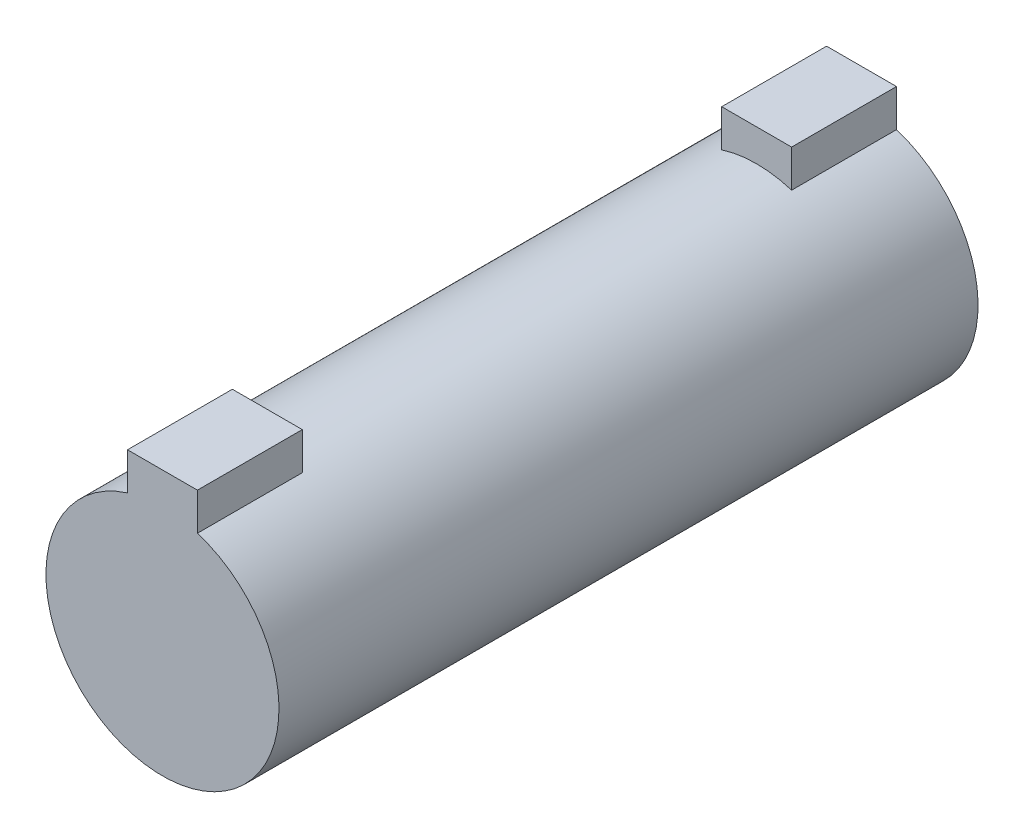
ISO-10303-21;
HEADER;
FILE_DESCRIPTION(('STEP AP214'),'2;1');
FILE_NAME('part.step','',(''),(''),'','','');
FILE_SCHEMA(('AUTOMOTIVE_DESIGN { 1 0 10303 214 1 1 1 1 }'));
ENDSEC;
DATA;
#1=APPLICATION_CONTEXT('core data for automotive mechanical design processes');
#2=APPLICATION_PROTOCOL_DEFINITION('international standard','automotive_design',2000,#1);
#3=PRODUCT_CONTEXT('',#1,'mechanical');
#4=PRODUCT('Part','Part','',(#3));
#5=PRODUCT_RELATED_PRODUCT_CATEGORY('part','',(#4));
#6=PRODUCT_DEFINITION_FORMATION('','',#4);
#7=PRODUCT_DEFINITION_CONTEXT('part definition',#1,'design');
#8=PRODUCT_DEFINITION('design','',#6,#7);
#9=PRODUCT_DEFINITION_SHAPE('','',#8);
#10=(LENGTH_UNIT() NAMED_UNIT(*) SI_UNIT(.MILLI.,.METRE.));
#11=(NAMED_UNIT(*) PLANE_ANGLE_UNIT() SI_UNIT($,.RADIAN.));
#12=(NAMED_UNIT(*) SI_UNIT($,.STERADIAN.) SOLID_ANGLE_UNIT());
#13=UNCERTAINTY_MEASURE_WITH_UNIT(LENGTH_MEASURE(1.E-05),#10,'distance_accuracy_value','');
#14=(GEOMETRIC_REPRESENTATION_CONTEXT(3) GLOBAL_UNCERTAINTY_ASSIGNED_CONTEXT((#13)) GLOBAL_UNIT_ASSIGNED_CONTEXT((#10,
#11,#12)) REPRESENTATION_CONTEXT('',''));
#15=CARTESIAN_POINT('',(0.,0.,0.));
#16=DIRECTION('',(0.,0.,1.));
#17=DIRECTION('',(1.,0.,0.));
#18=AXIS2_PLACEMENT_3D('',#15,#16,#17);
#19=CARTESIAN_POINT('',(0.,0.,30.));
#20=DIRECTION('',(0.,0.,-1.));
#21=DIRECTION('',(-1.,0.,0.));
#22=AXIS2_PLACEMENT_3D('',#19,#20,#21);
#23=CYLINDRICAL_SURFACE('',#22,10.);
#24=CARTESIAN_POINT('',(0.,0.,30.));
#25=DIRECTION('',(0.,0.,1.));
#26=DIRECTION('',(1.,0.,0.));
#27=AXIS2_PLACEMENT_3D('',#24,#25,#26);
#28=CIRCLE('',#27,10.);
#29=CARTESIAN_POINT('',(-3.,9.53939201416946,30.));
#30=VERTEX_POINT('',#29);
#31=CARTESIAN_POINT('',(3.,9.53939201416946,30.));
#32=VERTEX_POINT('',#31);
#33=EDGE_CURVE('E160',#30,#32,#28,.T.);
#34=ORIENTED_EDGE('',*,*,#33,.F.);
#35=DIRECTION('',(0.,0.,-1.));
#36=VECTOR('',#35,1.);
#37=CARTESIAN_POINT('',(-3.,9.53939201416945,30.));
#38=LINE('',#37,#36);
#39=CARTESIAN_POINT('',(-3.,9.53939201416945,21.));
#40=VERTEX_POINT('',#39);
#41=EDGE_CURVE('E156',#30,#40,#38,.T.);
#42=ORIENTED_EDGE('',*,*,#41,.T.);
#43=CARTESIAN_POINT('',(0.,0.,21.));
#44=DIRECTION('',(0.,0.,-1.));
#45=DIRECTION('',(-1.,0.,0.));
#46=AXIS2_PLACEMENT_3D('',#43,#44,#45);
#47=CIRCLE('',#46,10.);
#48=CARTESIAN_POINT('',(3.,9.53939201416946,21.));
#49=VERTEX_POINT('',#48);
#50=EDGE_CURVE('E45',#40,#49,#47,.T.);
#51=ORIENTED_EDGE('',*,*,#50,.T.);
#52=DIRECTION('',(0.,0.,-1.));
#53=VECTOR('',#52,1.);
#54=CARTESIAN_POINT('',(3.,9.53939201416946,30.));
#55=LINE('',#54,#53);
#56=EDGE_CURVE('E151',#49,#32,#55,.F.);
#57=ORIENTED_EDGE('',*,*,#56,.T.);
#58=EDGE_LOOP('',(#34,#42,#51,#57));
#59=FACE_BOUND('',#58,.T.);
#60=DIRECTION('',(0.,0.,-1.));
#61=VECTOR('',#60,1.);
#62=CARTESIAN_POINT('',(-3.,9.53939201416945,30.));
#63=LINE('',#62,#61);
#64=CARTESIAN_POINT('',(-3.,9.53939201416946,-30.));
#65=VERTEX_POINT('',#64);
#66=CARTESIAN_POINT('',(-3.,9.53939201416945,-21.));
#67=VERTEX_POINT('',#66);
#68=EDGE_CURVE('E121',#65,#67,#63,.F.);
#69=ORIENTED_EDGE('',*,*,#68,.F.);
#70=CARTESIAN_POINT('',(0.,0.,-30.));
#71=DIRECTION('',(0.,0.,1.));
#72=DIRECTION('',(1.,0.,0.));
#73=AXIS2_PLACEMENT_3D('',#70,#71,#72);
#74=CIRCLE('',#73,10.);
#75=CARTESIAN_POINT('',(3.,9.53939201416946,-30.));
#76=VERTEX_POINT('',#75);
#77=EDGE_CURVE('E159',#65,#76,#74,.T.);
#78=ORIENTED_EDGE('',*,*,#77,.T.);
#79=DIRECTION('',(0.,0.,-1.));
#80=VECTOR('',#79,1.);
#81=CARTESIAN_POINT('',(3.,9.53939201416946,30.));
#82=LINE('',#81,#80);
#83=CARTESIAN_POINT('',(3.,9.53939201416946,-21.));
#84=VERTEX_POINT('',#83);
#85=EDGE_CURVE('E55',#84,#76,#82,.T.);
#86=ORIENTED_EDGE('',*,*,#85,.F.);
#87=CARTESIAN_POINT('',(0.,0.,-21.));
#88=DIRECTION('',(0.,0.,1.));
#89=DIRECTION('',(1.,0.,0.));
#90=AXIS2_PLACEMENT_3D('',#87,#88,#89);
#91=CIRCLE('',#90,10.);
#92=EDGE_CURVE('E11',#84,#67,#91,.T.);
#93=ORIENTED_EDGE('',*,*,#92,.T.);
#94=EDGE_LOOP('',(#69,#78,#86,#93));
#95=FACE_BOUND('',#94,.T.);
#96=ADVANCED_FACE('F38',(#59,#95),#23,.T.);
#97=CARTESIAN_POINT('',(0.,0.,30.));
#98=DIRECTION('',(0.,0.,1.));
#99=DIRECTION('',(1.,0.,0.));
#100=AXIS2_PLACEMENT_3D('',#97,#98,#99);
#101=PLANE('',#100);
#102=ORIENTED_EDGE('',*,*,#33,.T.);
#103=DIRECTION('',(0.,1.,0.));
#104=VECTOR('',#103,1.);
#105=CARTESIAN_POINT('',(3.,12.745019423315,30.));
#106=LINE('',#105,#104);
#107=CARTESIAN_POINT('',(3.,12.745019423315,30.));
#108=VERTEX_POINT('',#107);
#109=EDGE_CURVE('E145',#32,#108,#106,.T.);
#110=ORIENTED_EDGE('',*,*,#109,.T.);
#111=DIRECTION('',(-1.,0.,0.));
#112=VECTOR('',#111,1.);
#113=CARTESIAN_POINT('',(3.,12.745019423315,30.));
#114=LINE('',#113,#112);
#115=CARTESIAN_POINT('',(-3.,12.745019423315,30.));
#116=VERTEX_POINT('',#115);
#117=EDGE_CURVE('E138',#108,#116,#114,.T.);
#118=ORIENTED_EDGE('',*,*,#117,.T.);
#119=DIRECTION('',(0.,-1.,0.));
#120=VECTOR('',#119,1.);
#121=CARTESIAN_POINT('',(-3.,12.745019423315,30.));
#122=LINE('',#121,#120);
#123=EDGE_CURVE('E133',#116,#30,#122,.T.);
#124=ORIENTED_EDGE('',*,*,#123,.T.);
#125=EDGE_LOOP('',(#102,#110,#118,#124));
#126=FACE_BOUND('',#125,.T.);
#127=ADVANCED_FACE('F182',(#126),#101,.T.);
#128=CARTESIAN_POINT('',(0.,0.,-30.));
#129=DIRECTION('',(0.,0.,1.));
#130=DIRECTION('',(1.,0.,0.));
#131=AXIS2_PLACEMENT_3D('',#128,#129,#130);
#132=PLANE('',#131);
#133=ORIENTED_EDGE('',*,*,#77,.F.);
#134=DIRECTION('',(0.,-1.,0.));
#135=VECTOR('',#134,1.);
#136=CARTESIAN_POINT('',(-3.,12.745019423315,-30.));
#137=LINE('',#136,#135);
#138=CARTESIAN_POINT('',(-3.,12.745019423315,-30.));
#139=VERTEX_POINT('',#138);
#140=EDGE_CURVE('E127',#139,#65,#137,.T.);
#141=ORIENTED_EDGE('',*,*,#140,.F.);
#142=DIRECTION('',(-1.,0.,0.));
#143=VECTOR('',#142,1.);
#144=CARTESIAN_POINT('',(3.,12.745019423315,-30.));
#145=LINE('',#144,#143);
#146=CARTESIAN_POINT('',(3.,12.745019423315,-30.));
#147=VERTEX_POINT('',#146);
#148=EDGE_CURVE('E114',#147,#139,#145,.T.);
#149=ORIENTED_EDGE('',*,*,#148,.F.);
#150=DIRECTION('',(0.,1.,0.));
#151=VECTOR('',#150,1.);
#152=CARTESIAN_POINT('',(3.,12.745019423315,-30.));
#153=LINE('',#152,#151);
#154=EDGE_CURVE('E122',#76,#147,#153,.T.);
#155=ORIENTED_EDGE('',*,*,#154,.F.);
#156=EDGE_LOOP('',(#133,#141,#149,#155));
#157=FACE_BOUND('',#156,.T.);
#158=ADVANCED_FACE('F184',(#157),#132,.F.);
#159=CARTESIAN_POINT('',(-3.,12.745019423315,21.));
#160=DIRECTION('',(-1.,0.,0.));
#161=DIRECTION('',(0.,0.,1.));
#162=AXIS2_PLACEMENT_3D('',#159,#160,#161);
#163=PLANE('',#162);
#164=ORIENTED_EDGE('',*,*,#41,.F.);
#165=ORIENTED_EDGE('',*,*,#123,.F.);
#166=DIRECTION('',(0.,0.,1.));
#167=VECTOR('',#166,1.);
#168=CARTESIAN_POINT('',(-3.,12.745019423315,21.));
#169=LINE('',#168,#167);
#170=CARTESIAN_POINT('',(-3.,12.745019423315,21.));
#171=VERTEX_POINT('',#170);
#172=EDGE_CURVE('E149',#171,#116,#169,.T.);
#173=ORIENTED_EDGE('',*,*,#172,.F.);
#174=DIRECTION('',(0.,-1.,0.));
#175=VECTOR('',#174,1.);
#176=CARTESIAN_POINT('',(-3.,12.745019423315,21.));
#177=LINE('',#176,#175);
#178=EDGE_CURVE('E134',#171,#40,#177,.T.);
#179=ORIENTED_EDGE('',*,*,#178,.T.);
#180=EDGE_LOOP('',(#164,#165,#173,#179));
#181=FACE_BOUND('',#180,.T.);
#182=ADVANCED_FACE('F173',(#181),#163,.T.);
#183=CARTESIAN_POINT('',(3.,12.745019423315,21.));
#184=DIRECTION('',(1.,0.,0.));
#185=DIRECTION('',(0.,0.,-1.));
#186=AXIS2_PLACEMENT_3D('',#183,#184,#185);
#187=PLANE('',#186);
#188=ORIENTED_EDGE('',*,*,#56,.F.);
#189=DIRECTION('',(0.,1.,0.));
#190=VECTOR('',#189,1.);
#191=CARTESIAN_POINT('',(3.,12.745019423315,21.));
#192=LINE('',#191,#190);
#193=CARTESIAN_POINT('',(3.,12.745019423315,21.));
#194=VERTEX_POINT('',#193);
#195=EDGE_CURVE('E137',#49,#194,#192,.T.);
#196=ORIENTED_EDGE('',*,*,#195,.T.);
#197=DIRECTION('',(0.,0.,1.));
#198=VECTOR('',#197,1.);
#199=CARTESIAN_POINT('',(3.,12.745019423315,21.));
#200=LINE('',#199,#198);
#201=EDGE_CURVE('E143',#194,#108,#200,.T.);
#202=ORIENTED_EDGE('',*,*,#201,.T.);
#203=ORIENTED_EDGE('',*,*,#109,.F.);
#204=EDGE_LOOP('',(#188,#196,#202,#203));
#205=FACE_BOUND('',#204,.T.);
#206=ADVANCED_FACE('F180',(#205),#187,.T.);
#207=CARTESIAN_POINT('',(3.,12.745019423315,21.));
#208=DIRECTION('',(0.,1.,0.));
#209=DIRECTION('',(0.,0.,1.));
#210=AXIS2_PLACEMENT_3D('',#207,#208,#209);
#211=PLANE('',#210);
#212=ORIENTED_EDGE('',*,*,#117,.F.);
#213=ORIENTED_EDGE('',*,*,#201,.F.);
#214=DIRECTION('',(-1.,0.,0.));
#215=VECTOR('',#214,1.);
#216=CARTESIAN_POINT('',(3.,12.745019423315,21.));
#217=LINE('',#216,#215);
#218=EDGE_CURVE('E140',#194,#171,#217,.T.);
#219=ORIENTED_EDGE('',*,*,#218,.T.);
#220=ORIENTED_EDGE('',*,*,#172,.T.);
#221=EDGE_LOOP('',(#212,#213,#219,#220));
#222=FACE_BOUND('',#221,.T.);
#223=ADVANCED_FACE('F177',(#222),#211,.T.);
#224=CARTESIAN_POINT('',(0.,0.,21.));
#225=DIRECTION('',(0.,0.,-1.));
#226=DIRECTION('',(-1.,0.,0.));
#227=AXIS2_PLACEMENT_3D('',#224,#225,#226);
#228=PLANE('',#227);
#229=ORIENTED_EDGE('',*,*,#50,.F.);
#230=ORIENTED_EDGE('',*,*,#178,.F.);
#231=ORIENTED_EDGE('',*,*,#218,.F.);
#232=ORIENTED_EDGE('',*,*,#195,.F.);
#233=EDGE_LOOP('',(#229,#230,#231,#232));
#234=FACE_BOUND('',#233,.T.);
#235=ADVANCED_FACE('F170',(#234),#228,.T.);
#236=CARTESIAN_POINT('',(-3.,12.745019423315,-21.));
#237=DIRECTION('',(1.,0.,0.));
#238=DIRECTION('',(0.,0.,-1.));
#239=AXIS2_PLACEMENT_3D('',#236,#237,#238);
#240=PLANE('',#239);
#241=ORIENTED_EDGE('',*,*,#140,.T.);
#242=ORIENTED_EDGE('',*,*,#68,.T.);
#243=DIRECTION('',(0.,-1.,0.));
#244=VECTOR('',#243,1.);
#245=CARTESIAN_POINT('',(-3.,12.745019423315,-21.));
#246=LINE('',#245,#244);
#247=CARTESIAN_POINT('',(-3.,12.745019423315,-21.));
#248=VERTEX_POINT('',#247);
#249=EDGE_CURVE('E103',#248,#67,#246,.T.);
#250=ORIENTED_EDGE('',*,*,#249,.F.);
#251=DIRECTION('',(0.,0.,-1.));
#252=VECTOR('',#251,1.);
#253=CARTESIAN_POINT('',(-3.,12.745019423315,-21.));
#254=LINE('',#253,#252);
#255=EDGE_CURVE('E111',#248,#139,#254,.T.);
#256=ORIENTED_EDGE('',*,*,#255,.T.);
#257=EDGE_LOOP('',(#241,#242,#250,#256));
#258=FACE_BOUND('',#257,.T.);
#259=ADVANCED_FACE('F120',(#258),#240,.F.);
#260=CARTESIAN_POINT('',(3.,12.745019423315,-21.));
#261=DIRECTION('',(-1.,0.,0.));
#262=DIRECTION('',(0.,0.,1.));
#263=AXIS2_PLACEMENT_3D('',#260,#261,#262);
#264=PLANE('',#263);
#265=DIRECTION('',(0.,1.,0.));
#266=VECTOR('',#265,1.);
#267=CARTESIAN_POINT('',(3.,12.745019423315,-21.));
#268=LINE('',#267,#266);
#269=CARTESIAN_POINT('',(3.,12.745019423315,-21.));
#270=VERTEX_POINT('',#269);
#271=EDGE_CURVE('E105',#84,#270,#268,.T.);
#272=ORIENTED_EDGE('',*,*,#271,.F.);
#273=ORIENTED_EDGE('',*,*,#85,.T.);
#274=ORIENTED_EDGE('',*,*,#154,.T.);
#275=DIRECTION('',(0.,0.,-1.));
#276=VECTOR('',#275,1.);
#277=CARTESIAN_POINT('',(3.,12.745019423315,-21.));
#278=LINE('',#277,#276);
#279=EDGE_CURVE('E118',#270,#147,#278,.T.);
#280=ORIENTED_EDGE('',*,*,#279,.F.);
#281=EDGE_LOOP('',(#272,#273,#274,#280));
#282=FACE_BOUND('',#281,.T.);
#283=ADVANCED_FACE('F202',(#282),#264,.F.);
#284=CARTESIAN_POINT('',(3.,12.745019423315,-21.));
#285=DIRECTION('',(0.,-1.,0.));
#286=DIRECTION('',(0.,0.,-1.));
#287=AXIS2_PLACEMENT_3D('',#284,#285,#286);
#288=PLANE('',#287);
#289=ORIENTED_EDGE('',*,*,#148,.T.);
#290=ORIENTED_EDGE('',*,*,#255,.F.);
#291=DIRECTION('',(-1.,0.,0.));
#292=VECTOR('',#291,1.);
#293=CARTESIAN_POINT('',(3.,12.745019423315,-21.));
#294=LINE('',#293,#292);
#295=EDGE_CURVE('E99',#270,#248,#294,.T.);
#296=ORIENTED_EDGE('',*,*,#295,.F.);
#297=ORIENTED_EDGE('',*,*,#279,.T.);
#298=EDGE_LOOP('',(#289,#290,#296,#297));
#299=FACE_BOUND('',#298,.T.);
#300=ADVANCED_FACE('F112',(#299),#288,.F.);
#301=CARTESIAN_POINT('',(0.,0.,-21.));
#302=DIRECTION('',(0.,0.,1.));
#303=DIRECTION('',(-1.,0.,0.));
#304=AXIS2_PLACEMENT_3D('',#301,#302,#303);
#305=PLANE('',#304);
#306=ORIENTED_EDGE('',*,*,#92,.F.);
#307=ORIENTED_EDGE('',*,*,#271,.T.);
#308=ORIENTED_EDGE('',*,*,#295,.T.);
#309=ORIENTED_EDGE('',*,*,#249,.T.);
#310=EDGE_LOOP('',(#306,#307,#308,#309));
#311=FACE_BOUND('',#310,.T.);
#312=ADVANCED_FACE('F101',(#311),#305,.T.);
#313=CLOSED_SHELL('',(#96,#127,#158,#182,#206,#223,#235,#259,#283,#300,#312));
#314=MANIFOLD_SOLID_BREP('B2',#313);
#315=ADVANCED_BREP_SHAPE_REPRESENTATION('',(#18,#314),#14);
#316=SHAPE_DEFINITION_REPRESENTATION(#9,#315);
ENDSEC;
END-ISO-10303-21;
